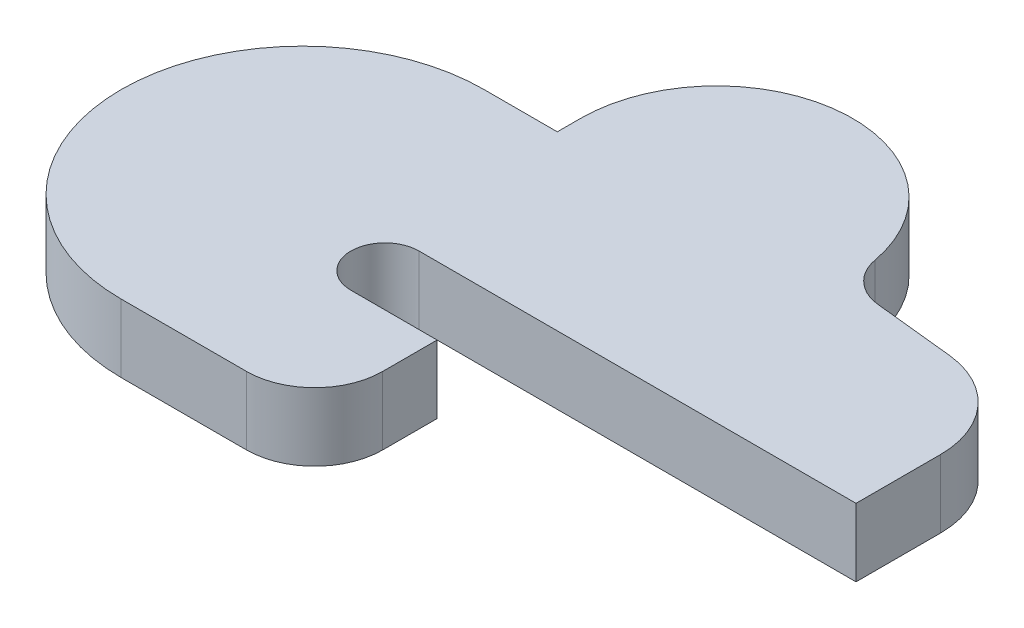
ISO-10303-21;
HEADER;
FILE_DESCRIPTION(('STEP AP214'),'2;1');
FILE_NAME('part.step','',(''),(''),'','','');
FILE_SCHEMA(('AUTOMOTIVE_DESIGN { 1 0 10303 214 1 1 1 1 }'));
ENDSEC;
DATA;
#1=APPLICATION_CONTEXT('core data for automotive mechanical design processes');
#2=APPLICATION_PROTOCOL_DEFINITION('international standard','automotive_design',2000,#1);
#3=PRODUCT_CONTEXT('',#1,'mechanical');
#4=PRODUCT('Part','Part','',(#3));
#5=PRODUCT_RELATED_PRODUCT_CATEGORY('part','',(#4));
#6=PRODUCT_DEFINITION_FORMATION('','',#4);
#7=PRODUCT_DEFINITION_CONTEXT('part definition',#1,'design');
#8=PRODUCT_DEFINITION('design','',#6,#7);
#9=PRODUCT_DEFINITION_SHAPE('','',#8);
#10=(LENGTH_UNIT() NAMED_UNIT(*) SI_UNIT(.MILLI.,.METRE.));
#11=(NAMED_UNIT(*) PLANE_ANGLE_UNIT() SI_UNIT($,.RADIAN.));
#12=(NAMED_UNIT(*) SI_UNIT($,.STERADIAN.) SOLID_ANGLE_UNIT());
#13=UNCERTAINTY_MEASURE_WITH_UNIT(LENGTH_MEASURE(1.E-05),#10,'distance_accuracy_value','');
#14=(GEOMETRIC_REPRESENTATION_CONTEXT(3) GLOBAL_UNCERTAINTY_ASSIGNED_CONTEXT((#13)) GLOBAL_UNIT_ASSIGNED_CONTEXT((#10,
#11,#12)) REPRESENTATION_CONTEXT('',''));
#15=CARTESIAN_POINT('',(0.,0.,0.));
#16=DIRECTION('',(0.,0.,1.));
#17=DIRECTION('',(1.,0.,0.));
#18=AXIS2_PLACEMENT_3D('',#15,#16,#17);
#19=CARTESIAN_POINT('',(0.,3.,2.4));
#20=DIRECTION('',(-1.,0.,0.));
#21=DIRECTION('',(0.,0.,1.));
#22=AXIS2_PLACEMENT_3D('',#19,#20,#21);
#23=PLANE('',#22);
#24=DIRECTION('',(0.,0.,-1.));
#25=VECTOR('',#24,1.);
#26=CARTESIAN_POINT('',(0.,0.,2.4));
#27=LINE('',#26,#25);
#28=CARTESIAN_POINT('',(0.,0.,2.4));
#29=VERTEX_POINT('',#28);
#30=CARTESIAN_POINT('',(0.,0.,0.));
#31=VERTEX_POINT('',#30);
#32=EDGE_CURVE('E165',#29,#31,#27,.T.);
#33=ORIENTED_EDGE('',*,*,#32,.T.);
#34=DIRECTION('',(0.,-1.,0.));
#35=VECTOR('',#34,1.);
#36=CARTESIAN_POINT('',(0.,3.,0.));
#37=LINE('',#36,#35);
#38=CARTESIAN_POINT('',(0.,3.,0.));
#39=VERTEX_POINT('',#38);
#40=EDGE_CURVE('E11',#39,#31,#37,.T.);
#41=ORIENTED_EDGE('',*,*,#40,.F.);
#42=DIRECTION('',(0.,0.,-1.));
#43=VECTOR('',#42,1.);
#44=CARTESIAN_POINT('',(0.,3.,2.4));
#45=LINE('',#44,#43);
#46=CARTESIAN_POINT('',(0.,3.,2.4));
#47=VERTEX_POINT('',#46);
#48=EDGE_CURVE('E191',#47,#39,#45,.T.);
#49=ORIENTED_EDGE('',*,*,#48,.F.);
#50=DIRECTION('',(0.,-1.,0.));
#51=VECTOR('',#50,1.);
#52=CARTESIAN_POINT('',(0.,3.,2.4));
#53=LINE('',#52,#51);
#54=EDGE_CURVE('E161',#47,#29,#53,.T.);
#55=ORIENTED_EDGE('',*,*,#54,.T.);
#56=EDGE_LOOP('',(#33,#41,#49,#55));
#57=FACE_BOUND('',#56,.T.);
#58=ADVANCED_FACE('F33',(#57),#23,.F.);
#59=CARTESIAN_POINT('',(0.,3.,0.));
#60=DIRECTION('',(0.,0.,1.));
#61=DIRECTION('',(1.,0.,0.));
#62=AXIS2_PLACEMENT_3D('',#59,#60,#61);
#63=PLANE('',#62);
#64=DIRECTION('',(-1.,0.,0.));
#65=VECTOR('',#64,1.);
#66=CARTESIAN_POINT('',(0.,0.,0.));
#67=LINE('',#66,#65);
#68=CARTESIAN_POINT('',(-3.8,0.,0.));
#69=VERTEX_POINT('',#68);
#70=EDGE_CURVE('E168',#31,#69,#67,.T.);
#71=ORIENTED_EDGE('',*,*,#70,.T.);
#72=DIRECTION('',(0.,-1.,0.));
#73=VECTOR('',#72,1.);
#74=CARTESIAN_POINT('',(-3.8,3.,0.));
#75=LINE('',#74,#73);
#76=CARTESIAN_POINT('',(-3.8,3.,0.));
#77=VERTEX_POINT('',#76);
#78=EDGE_CURVE('E41',#77,#69,#75,.T.);
#79=ORIENTED_EDGE('',*,*,#78,.F.);
#80=DIRECTION('',(-1.,0.,0.));
#81=VECTOR('',#80,1.);
#82=CARTESIAN_POINT('',(0.,3.,0.));
#83=LINE('',#82,#81);
#84=EDGE_CURVE('E110',#39,#77,#83,.T.);
#85=ORIENTED_EDGE('',*,*,#84,.F.);
#86=ORIENTED_EDGE('',*,*,#40,.T.);
#87=EDGE_LOOP('',(#71,#79,#85,#86));
#88=FACE_BOUND('',#87,.T.);
#89=ADVANCED_FACE('F279',(#88),#63,.F.);
#90=CARTESIAN_POINT('',(-3.8,3.,-1.5));
#91=DIRECTION('',(0.,-1.,0.));
#92=DIRECTION('',(0.,0.,-1.));
#93=AXIS2_PLACEMENT_3D('',#90,#91,#92);
#94=CYLINDRICAL_SURFACE('',#93,1.5);
#95=CARTESIAN_POINT('',(-3.8,0.,-1.5));
#96=DIRECTION('',(0.,-1.,0.));
#97=DIRECTION('',(0.,0.,-1.));
#98=AXIS2_PLACEMENT_3D('',#95,#96,#97);
#99=CIRCLE('',#98,1.5);
#100=CARTESIAN_POINT('',(-3.8,0.,-3.));
#101=VERTEX_POINT('',#100);
#102=EDGE_CURVE('E170',#69,#101,#99,.T.);
#103=ORIENTED_EDGE('',*,*,#102,.T.);
#104=DIRECTION('',(0.,-1.,0.));
#105=VECTOR('',#104,1.);
#106=CARTESIAN_POINT('',(-3.8,3.,-3.));
#107=LINE('',#106,#105);
#108=CARTESIAN_POINT('',(-3.8,3.,-3.));
#109=VERTEX_POINT('',#108);
#110=EDGE_CURVE('E216',#109,#101,#107,.T.);
#111=ORIENTED_EDGE('',*,*,#110,.F.);
#112=CARTESIAN_POINT('',(-3.8,3.,-1.5));
#113=DIRECTION('',(0.,-1.,0.));
#114=DIRECTION('',(0.,0.,-1.));
#115=AXIS2_PLACEMENT_3D('',#112,#113,#114);
#116=CIRCLE('',#115,1.5);
#117=EDGE_CURVE('E224',#77,#109,#116,.T.);
#118=ORIENTED_EDGE('',*,*,#117,.F.);
#119=ORIENTED_EDGE('',*,*,#78,.T.);
#120=EDGE_LOOP('',(#103,#111,#118,#119));
#121=FACE_BOUND('',#120,.T.);
#122=ADVANCED_FACE('F222',(#121),#94,.F.);
#123=CARTESIAN_POINT('',(-3.8,3.,-3.));
#124=DIRECTION('',(0.,0.,-1.));
#125=DIRECTION('',(-1.,0.,0.));
#126=AXIS2_PLACEMENT_3D('',#123,#124,#125);
#127=PLANE('',#126);
#128=DIRECTION('',(1.,0.,0.));
#129=VECTOR('',#128,1.);
#130=CARTESIAN_POINT('',(-3.8,0.,-3.));
#131=LINE('',#130,#129);
#132=CARTESIAN_POINT('',(15.47,0.,-3.));
#133=VERTEX_POINT('',#132);
#134=EDGE_CURVE('E172',#101,#133,#131,.T.);
#135=ORIENTED_EDGE('',*,*,#134,.T.);
#136=DIRECTION('',(0.,-1.,0.));
#137=VECTOR('',#136,1.);
#138=CARTESIAN_POINT('',(15.47,3.,-3.));
#139=LINE('',#138,#137);
#140=CARTESIAN_POINT('',(15.47,3.,-3.));
#141=VERTEX_POINT('',#140);
#142=EDGE_CURVE('E213',#141,#133,#139,.T.);
#143=ORIENTED_EDGE('',*,*,#142,.F.);
#144=DIRECTION('',(1.,0.,0.));
#145=VECTOR('',#144,1.);
#146=CARTESIAN_POINT('',(-3.8,3.,-3.));
#147=LINE('',#146,#145);
#148=EDGE_CURVE('E242',#109,#141,#147,.T.);
#149=ORIENTED_EDGE('',*,*,#148,.F.);
#150=ORIENTED_EDGE('',*,*,#110,.T.);
#151=EDGE_LOOP('',(#135,#143,#149,#150));
#152=FACE_BOUND('',#151,.T.);
#153=ADVANCED_FACE('F233',(#152),#127,.F.);
#154=CARTESIAN_POINT('',(15.47,3.,-3.));
#155=DIRECTION('',(-1.,0.,0.));
#156=DIRECTION('',(0.,0.,1.));
#157=AXIS2_PLACEMENT_3D('',#154,#155,#156);
#158=PLANE('',#157);
#159=DIRECTION('',(0.,0.,-1.));
#160=VECTOR('',#159,1.);
#161=CARTESIAN_POINT('',(15.47,0.,-3.));
#162=LINE('',#161,#160);
#163=CARTESIAN_POINT('',(15.47,0.,-6.72935954126035));
#164=VERTEX_POINT('',#163);
#165=EDGE_CURVE('E174',#133,#164,#162,.T.);
#166=ORIENTED_EDGE('',*,*,#165,.T.);
#167=DIRECTION('',(0.,-1.,0.));
#168=VECTOR('',#167,1.);
#169=CARTESIAN_POINT('',(15.47,3.,-6.72935954126035));
#170=LINE('',#169,#168);
#171=CARTESIAN_POINT('',(15.47,3.,-6.72935954126035));
#172=VERTEX_POINT('',#171);
#173=EDGE_CURVE('E210',#172,#164,#170,.T.);
#174=ORIENTED_EDGE('',*,*,#173,.F.);
#175=DIRECTION('',(0.,0.,-1.));
#176=VECTOR('',#175,1.);
#177=CARTESIAN_POINT('',(15.47,3.,-3.));
#178=LINE('',#177,#176);
#179=EDGE_CURVE('E239',#141,#172,#178,.T.);
#180=ORIENTED_EDGE('',*,*,#179,.F.);
#181=ORIENTED_EDGE('',*,*,#142,.T.);
#182=EDGE_LOOP('',(#166,#174,#180,#181));
#183=FACE_BOUND('',#182,.T.);
#184=ADVANCED_FACE('F237',(#183),#158,.F.);
#185=CARTESIAN_POINT('',(11.47,3.,-6.72935954126034));
#186=DIRECTION('',(0.,-1.,0.));
#187=DIRECTION('',(0.,0.,-1.));
#188=AXIS2_PLACEMENT_3D('',#185,#186,#187);
#189=CYLINDRICAL_SURFACE('',#188,4.);
#190=CARTESIAN_POINT('',(11.47,0.,-6.72935954126034));
#191=DIRECTION('',(0.,1.,0.));
#192=DIRECTION('',(0.,0.,1.));
#193=AXIS2_PLACEMENT_3D('',#190,#191,#192);
#194=CIRCLE('',#193,4.);
#195=CARTESIAN_POINT('',(11.8881138530706,0.,-10.7074471227334));
#196=VERTEX_POINT('',#195);
#197=EDGE_CURVE('E176',#164,#196,#194,.T.);
#198=ORIENTED_EDGE('',*,*,#197,.T.);
#199=DIRECTION('',(0.,-1.,0.));
#200=VECTOR('',#199,1.);
#201=CARTESIAN_POINT('',(11.8881138530706,3.,-10.7074471227334));
#202=LINE('',#201,#200);
#203=CARTESIAN_POINT('',(11.8881138530706,3.,-10.7074471227334));
#204=VERTEX_POINT('',#203);
#205=EDGE_CURVE('E207',#204,#196,#202,.T.);
#206=ORIENTED_EDGE('',*,*,#205,.F.);
#207=CARTESIAN_POINT('',(11.47,3.,-6.72935954126034));
#208=DIRECTION('',(0.,1.,0.));
#209=DIRECTION('',(0.,0.,1.));
#210=AXIS2_PLACEMENT_3D('',#207,#208,#209);
#211=CIRCLE('',#210,4.);
#212=EDGE_CURVE('E241',#172,#204,#211,.T.);
#213=ORIENTED_EDGE('',*,*,#212,.F.);
#214=ORIENTED_EDGE('',*,*,#173,.T.);
#215=EDGE_LOOP('',(#198,#206,#213,#214));
#216=FACE_BOUND('',#215,.T.);
#217=ADVANCED_FACE('F292',(#216),#189,.T.);
#218=CARTESIAN_POINT('',(8.35978318046427,3.,-11.0782896198422));
#219=DIRECTION('',(-0.104528463267653,0.,0.994521895368273));
#220=DIRECTION('',(0.994521895368274,0.,0.104528463267653));
#221=AXIS2_PLACEMENT_3D('',#218,#219,#220);
#222=PLANE('',#221);
#223=DIRECTION('',(-0.994521895368274,0.,-0.104528463267653));
#224=VECTOR('',#223,1.);
#225=CARTESIAN_POINT('',(8.35978318046427,0.,-11.0782896198422));
#226=LINE('',#225,#224);
#227=CARTESIAN_POINT('',(8.35978318046427,0.,-11.0782896198422));
#228=VERTEX_POINT('',#227);
#229=EDGE_CURVE('E178',#196,#228,#226,.T.);
#230=ORIENTED_EDGE('',*,*,#229,.T.);
#231=DIRECTION('',(0.,-1.,0.));
#232=VECTOR('',#231,1.);
#233=CARTESIAN_POINT('',(8.35978318046427,3.,-11.0782896198422));
#234=LINE('',#233,#232);
#235=CARTESIAN_POINT('',(8.35978318046427,3.,-11.0782896198422));
#236=VERTEX_POINT('',#235);
#237=EDGE_CURVE('E204',#236,#228,#234,.T.);
#238=ORIENTED_EDGE('',*,*,#237,.F.);
#239=DIRECTION('',(-0.994521895368274,0.,-0.104528463267653));
#240=VECTOR('',#239,1.);
#241=CARTESIAN_POINT('',(8.35978318046427,3.,-11.0782896198422));
#242=LINE('',#241,#240);
#243=EDGE_CURVE('E244',#204,#236,#242,.T.);
#244=ORIENTED_EDGE('',*,*,#243,.F.);
#245=ORIENTED_EDGE('',*,*,#205,.T.);
#246=EDGE_LOOP('',(#230,#238,#244,#245));
#247=FACE_BOUND('',#246,.T.);
#248=ADVANCED_FACE('F295',(#247),#222,.F.);
#249=CARTESIAN_POINT('',(8.56884010699958,3.,-13.0673334105787));
#250=DIRECTION('',(0.,-1.,0.));
#251=DIRECTION('',(0.,0.,-1.));
#252=AXIS2_PLACEMENT_3D('',#249,#250,#251);
#253=CYLINDRICAL_SURFACE('',#252,2.);
#254=CARTESIAN_POINT('',(8.56884010699958,0.,-13.0673334105787));
#255=DIRECTION('',(0.,-1.,0.));
#256=DIRECTION('',(0.,0.,1.));
#257=AXIS2_PLACEMENT_3D('',#254,#255,#256);
#258=CIRCLE('',#257,2.);
#259=CARTESIAN_POINT('',(6.60163008024968,0.,-12.706660829621));
#260=VERTEX_POINT('',#259);
#261=EDGE_CURVE('E180',#228,#260,#258,.T.);
#262=ORIENTED_EDGE('',*,*,#261,.T.);
#263=DIRECTION('',(0.,-1.,0.));
#264=VECTOR('',#263,1.);
#265=CARTESIAN_POINT('',(6.60163008024968,3.,-12.706660829621));
#266=LINE('',#265,#264);
#267=CARTESIAN_POINT('',(6.60163008024968,3.,-12.706660829621));
#268=VERTEX_POINT('',#267);
#269=EDGE_CURVE('E201',#268,#260,#266,.T.);
#270=ORIENTED_EDGE('',*,*,#269,.F.);
#271=CARTESIAN_POINT('',(8.56884010699958,3.,-13.0673334105787));
#272=DIRECTION('',(0.,-1.,0.));
#273=DIRECTION('',(0.,0.,1.));
#274=AXIS2_PLACEMENT_3D('',#271,#272,#273);
#275=CIRCLE('',#274,2.);
#276=EDGE_CURVE('E250',#236,#268,#275,.T.);
#277=ORIENTED_EDGE('',*,*,#276,.F.);
#278=ORIENTED_EDGE('',*,*,#237,.T.);
#279=EDGE_LOOP('',(#262,#270,#277,#278));
#280=FACE_BOUND('',#279,.T.);
#281=ADVANCED_FACE('F299',(#280),#253,.F.);
#282=CARTESIAN_POINT('',(0.7,3.,-11.6246430867479));
#283=DIRECTION('',(0.,-1.,0.));
#284=DIRECTION('',(0.,0.,-1.));
#285=AXIS2_PLACEMENT_3D('',#282,#283,#284);
#286=CYLINDRICAL_SURFACE('',#285,6.);
#287=CARTESIAN_POINT('',(0.7,0.,-11.6246430867479));
#288=DIRECTION('',(0.,1.,0.));
#289=DIRECTION('',(0.,0.,-1.));
#290=AXIS2_PLACEMENT_3D('',#287,#288,#289);
#291=CIRCLE('',#290,6.);
#292=CARTESIAN_POINT('',(-5.3,0.,-11.6246430867479));
#293=VERTEX_POINT('',#292);
#294=EDGE_CURVE('E182',#260,#293,#291,.T.);
#295=ORIENTED_EDGE('',*,*,#294,.T.);
#296=DIRECTION('',(0.,-1.,0.));
#297=VECTOR('',#296,1.);
#298=CARTESIAN_POINT('',(-5.3,3.,-11.6246430867479));
#299=LINE('',#298,#297);
#300=CARTESIAN_POINT('',(-5.3,3.,-11.6246430867479));
#301=VERTEX_POINT('',#300);
#302=EDGE_CURVE('E198',#301,#293,#299,.T.);
#303=ORIENTED_EDGE('',*,*,#302,.F.);
#304=CARTESIAN_POINT('',(0.7,3.,-11.6246430867479));
#305=DIRECTION('',(0.,1.,0.));
#306=DIRECTION('',(0.,0.,-1.));
#307=AXIS2_PLACEMENT_3D('',#304,#305,#306);
#308=CIRCLE('',#307,6.);
#309=EDGE_CURVE('E252',#268,#301,#308,.T.);
#310=ORIENTED_EDGE('',*,*,#309,.F.);
#311=ORIENTED_EDGE('',*,*,#269,.T.);
#312=EDGE_LOOP('',(#295,#303,#310,#311));
#313=FACE_BOUND('',#312,.T.);
#314=ADVANCED_FACE('F303',(#313),#286,.T.);
#315=CARTESIAN_POINT('',(-5.3,3.,-10.6));
#316=DIRECTION('',(1.,0.,0.));
#317=DIRECTION('',(0.,0.,-1.));
#318=AXIS2_PLACEMENT_3D('',#315,#316,#317);
#319=PLANE('',#318);
#320=DIRECTION('',(0.,0.,1.));
#321=VECTOR('',#320,1.);
#322=CARTESIAN_POINT('',(-5.3,0.,-10.6));
#323=LINE('',#322,#321);
#324=CARTESIAN_POINT('',(-5.3,0.,-10.6));
#325=VERTEX_POINT('',#324);
#326=EDGE_CURVE('E184',#293,#325,#323,.T.);
#327=ORIENTED_EDGE('',*,*,#326,.T.);
#328=DIRECTION('',(0.,-1.,0.));
#329=VECTOR('',#328,1.);
#330=CARTESIAN_POINT('',(-5.3,3.,-10.6));
#331=LINE('',#330,#329);
#332=CARTESIAN_POINT('',(-5.3,3.,-10.6));
#333=VERTEX_POINT('',#332);
#334=EDGE_CURVE('E195',#333,#325,#331,.T.);
#335=ORIENTED_EDGE('',*,*,#334,.F.);
#336=DIRECTION('',(0.,0.,1.));
#337=VECTOR('',#336,1.);
#338=CARTESIAN_POINT('',(-5.3,3.,-10.6));
#339=LINE('',#338,#337);
#340=EDGE_CURVE('E254',#301,#333,#339,.T.);
#341=ORIENTED_EDGE('',*,*,#340,.F.);
#342=ORIENTED_EDGE('',*,*,#302,.T.);
#343=EDGE_LOOP('',(#327,#335,#341,#342));
#344=FACE_BOUND('',#343,.T.);
#345=ADVANCED_FACE('F260',(#344),#319,.F.);
#346=CARTESIAN_POINT('',(-5.3,3.,-10.6));
#347=DIRECTION('',(0.,0.,1.));
#348=DIRECTION('',(1.,0.,0.));
#349=AXIS2_PLACEMENT_3D('',#346,#347,#348);
#350=PLANE('',#349);
#351=DIRECTION('',(-1.,0.,0.));
#352=VECTOR('',#351,1.);
#353=CARTESIAN_POINT('',(-5.3,0.,-10.6));
#354=LINE('',#353,#352);
#355=CARTESIAN_POINT('',(-8.53,0.,-10.6));
#356=VERTEX_POINT('',#355);
#357=EDGE_CURVE('E186',#325,#356,#354,.T.);
#358=ORIENTED_EDGE('',*,*,#357,.T.);
#359=DIRECTION('',(0.,-1.,0.));
#360=VECTOR('',#359,1.);
#361=CARTESIAN_POINT('',(-8.53,3.,-10.6));
#362=LINE('',#361,#360);
#363=CARTESIAN_POINT('',(-8.53,3.,-10.6));
#364=VERTEX_POINT('',#363);
#365=EDGE_CURVE('E156',#364,#356,#362,.T.);
#366=ORIENTED_EDGE('',*,*,#365,.F.);
#367=DIRECTION('',(-1.,0.,0.));
#368=VECTOR('',#367,1.);
#369=CARTESIAN_POINT('',(-5.3,3.,-10.6));
#370=LINE('',#369,#368);
#371=EDGE_CURVE('E147',#333,#364,#370,.T.);
#372=ORIENTED_EDGE('',*,*,#371,.F.);
#373=ORIENTED_EDGE('',*,*,#334,.T.);
#374=EDGE_LOOP('',(#358,#366,#372,#373));
#375=FACE_BOUND('',#374,.T.);
#376=ADVANCED_FACE('F264',(#375),#350,.F.);
#377=CARTESIAN_POINT('',(-8.53,3.,-2.6));
#378=DIRECTION('',(0.,-1.,0.));
#379=DIRECTION('',(0.,0.,-1.));
#380=AXIS2_PLACEMENT_3D('',#377,#378,#379);
#381=CYLINDRICAL_SURFACE('',#380,8.);
#382=CARTESIAN_POINT('',(-8.53,0.,-2.6));
#383=DIRECTION('',(0.,1.,0.));
#384=DIRECTION('',(0.,0.,1.));
#385=AXIS2_PLACEMENT_3D('',#382,#383,#384);
#386=CIRCLE('',#385,8.);
#387=CARTESIAN_POINT('',(-8.53,0.,5.4));
#388=VERTEX_POINT('',#387);
#389=EDGE_CURVE('E155',#356,#388,#386,.T.);
#390=ORIENTED_EDGE('',*,*,#389,.T.);
#391=DIRECTION('',(0.,-1.,0.));
#392=VECTOR('',#391,1.);
#393=CARTESIAN_POINT('',(-8.53,3.,5.4));
#394=LINE('',#393,#392);
#395=CARTESIAN_POINT('',(-8.53,3.,5.4));
#396=VERTEX_POINT('',#395);
#397=EDGE_CURVE('E152',#396,#388,#394,.T.);
#398=ORIENTED_EDGE('',*,*,#397,.F.);
#399=CARTESIAN_POINT('',(-8.53,3.,-2.6));
#400=DIRECTION('',(0.,1.,0.));
#401=DIRECTION('',(0.,0.,1.));
#402=AXIS2_PLACEMENT_3D('',#399,#400,#401);
#403=CIRCLE('',#402,8.);
#404=EDGE_CURVE('E141',#364,#396,#403,.T.);
#405=ORIENTED_EDGE('',*,*,#404,.F.);
#406=ORIENTED_EDGE('',*,*,#365,.T.);
#407=EDGE_LOOP('',(#390,#398,#405,#406));
#408=FACE_BOUND('',#407,.T.);
#409=ADVANCED_FACE('F153',(#408),#381,.T.);
#410=CARTESIAN_POINT('',(-8.53,3.,5.4));
#411=DIRECTION('',(0.,0.,-1.));
#412=DIRECTION('',(-1.,0.,0.));
#413=AXIS2_PLACEMENT_3D('',#410,#411,#412);
#414=PLANE('',#413);
#415=DIRECTION('',(1.,0.,0.));
#416=VECTOR('',#415,1.);
#417=CARTESIAN_POINT('',(-8.53,0.,5.4));
#418=LINE('',#417,#416);
#419=CARTESIAN_POINT('',(-3.,0.,5.4));
#420=VERTEX_POINT('',#419);
#421=EDGE_CURVE('E96',#388,#420,#418,.T.);
#422=ORIENTED_EDGE('',*,*,#421,.T.);
#423=DIRECTION('',(0.,-1.,0.));
#424=VECTOR('',#423,1.);
#425=CARTESIAN_POINT('',(-3.,3.,5.4));
#426=LINE('',#425,#424);
#427=CARTESIAN_POINT('',(-3.,3.,5.4));
#428=VERTEX_POINT('',#427);
#429=EDGE_CURVE('E157',#428,#420,#426,.T.);
#430=ORIENTED_EDGE('',*,*,#429,.F.);
#431=DIRECTION('',(1.,0.,0.));
#432=VECTOR('',#431,1.);
#433=CARTESIAN_POINT('',(-8.53,3.,5.4));
#434=LINE('',#433,#432);
#435=EDGE_CURVE('E145',#396,#428,#434,.T.);
#436=ORIENTED_EDGE('',*,*,#435,.F.);
#437=ORIENTED_EDGE('',*,*,#397,.T.);
#438=EDGE_LOOP('',(#422,#430,#436,#437));
#439=FACE_BOUND('',#438,.T.);
#440=ADVANCED_FACE('F159',(#439),#414,.F.);
#441=CARTESIAN_POINT('',(-3.,3.,2.4));
#442=DIRECTION('',(0.,-1.,0.));
#443=DIRECTION('',(0.,0.,-1.));
#444=AXIS2_PLACEMENT_3D('',#441,#442,#443);
#445=CYLINDRICAL_SURFACE('',#444,3.);
#446=CARTESIAN_POINT('',(-3.,0.,2.4));
#447=DIRECTION('',(0.,1.,0.));
#448=DIRECTION('',(0.,0.,1.));
#449=AXIS2_PLACEMENT_3D('',#446,#447,#448);
#450=CIRCLE('',#449,3.);
#451=EDGE_CURVE('E102',#420,#29,#450,.T.);
#452=ORIENTED_EDGE('',*,*,#451,.T.);
#453=ORIENTED_EDGE('',*,*,#54,.F.);
#454=CARTESIAN_POINT('',(-3.,3.,2.4));
#455=DIRECTION('',(0.,1.,0.));
#456=DIRECTION('',(0.,0.,1.));
#457=AXIS2_PLACEMENT_3D('',#454,#455,#456);
#458=CIRCLE('',#457,3.);
#459=EDGE_CURVE('E49',#428,#47,#458,.T.);
#460=ORIENTED_EDGE('',*,*,#459,.F.);
#461=ORIENTED_EDGE('',*,*,#429,.T.);
#462=EDGE_LOOP('',(#452,#453,#460,#461));
#463=FACE_BOUND('',#462,.T.);
#464=ADVANCED_FACE('F268',(#463),#445,.T.);
#465=CARTESIAN_POINT('',(-3.8,3.,-1.5));
#466=DIRECTION('',(0.,-1.,0.));
#467=DIRECTION('',(0.,0.,-1.));
#468=AXIS2_PLACEMENT_3D('',#465,#466,#467);
#469=PLANE('',#468);
#470=ORIENTED_EDGE('',*,*,#48,.T.);
#471=ORIENTED_EDGE('',*,*,#84,.T.);
#472=ORIENTED_EDGE('',*,*,#117,.T.);
#473=ORIENTED_EDGE('',*,*,#148,.T.);
#474=ORIENTED_EDGE('',*,*,#179,.T.);
#475=ORIENTED_EDGE('',*,*,#212,.T.);
#476=ORIENTED_EDGE('',*,*,#243,.T.);
#477=ORIENTED_EDGE('',*,*,#276,.T.);
#478=ORIENTED_EDGE('',*,*,#309,.T.);
#479=ORIENTED_EDGE('',*,*,#340,.T.);
#480=ORIENTED_EDGE('',*,*,#371,.T.);
#481=ORIENTED_EDGE('',*,*,#404,.T.);
#482=ORIENTED_EDGE('',*,*,#435,.T.);
#483=ORIENTED_EDGE('',*,*,#459,.T.);
#484=EDGE_LOOP('',(#470,#471,#472,#473,#474,#475,#476,#477,#478,#479,#480,#481,#482,#483));
#485=FACE_BOUND('',#484,.T.);
#486=ADVANCED_FACE('F143',(#485),#469,.F.);
#487=CARTESIAN_POINT('',(-3.8,0.,-1.5));
#488=DIRECTION('',(0.,-1.,0.));
#489=DIRECTION('',(0.,0.,-1.));
#490=AXIS2_PLACEMENT_3D('',#487,#488,#489);
#491=PLANE('',#490);
#492=ORIENTED_EDGE('',*,*,#32,.F.);
#493=ORIENTED_EDGE('',*,*,#451,.F.);
#494=ORIENTED_EDGE('',*,*,#421,.F.);
#495=ORIENTED_EDGE('',*,*,#389,.F.);
#496=ORIENTED_EDGE('',*,*,#357,.F.);
#497=ORIENTED_EDGE('',*,*,#326,.F.);
#498=ORIENTED_EDGE('',*,*,#294,.F.);
#499=ORIENTED_EDGE('',*,*,#261,.F.);
#500=ORIENTED_EDGE('',*,*,#229,.F.);
#501=ORIENTED_EDGE('',*,*,#197,.F.);
#502=ORIENTED_EDGE('',*,*,#165,.F.);
#503=ORIENTED_EDGE('',*,*,#134,.F.);
#504=ORIENTED_EDGE('',*,*,#102,.F.);
#505=ORIENTED_EDGE('',*,*,#70,.F.);
#506=EDGE_LOOP('',(#492,#493,#494,#495,#496,#497,#498,#499,#500,#501,#502,#503,#504,#505));
#507=FACE_BOUND('',#506,.T.);
#508=ADVANCED_FACE('F228',(#507),#491,.T.);
#509=CLOSED_SHELL('',(#58,#89,#122,#153,#184,#217,#248,#281,#314,#345,#376,#409,#440,#464,#486,#508));
#510=MANIFOLD_SOLID_BREP('B2',#509);
#511=ADVANCED_BREP_SHAPE_REPRESENTATION('',(#18,#510),#14);
#512=SHAPE_DEFINITION_REPRESENTATION(#9,#511);
ENDSEC;
END-ISO-10303-21;
